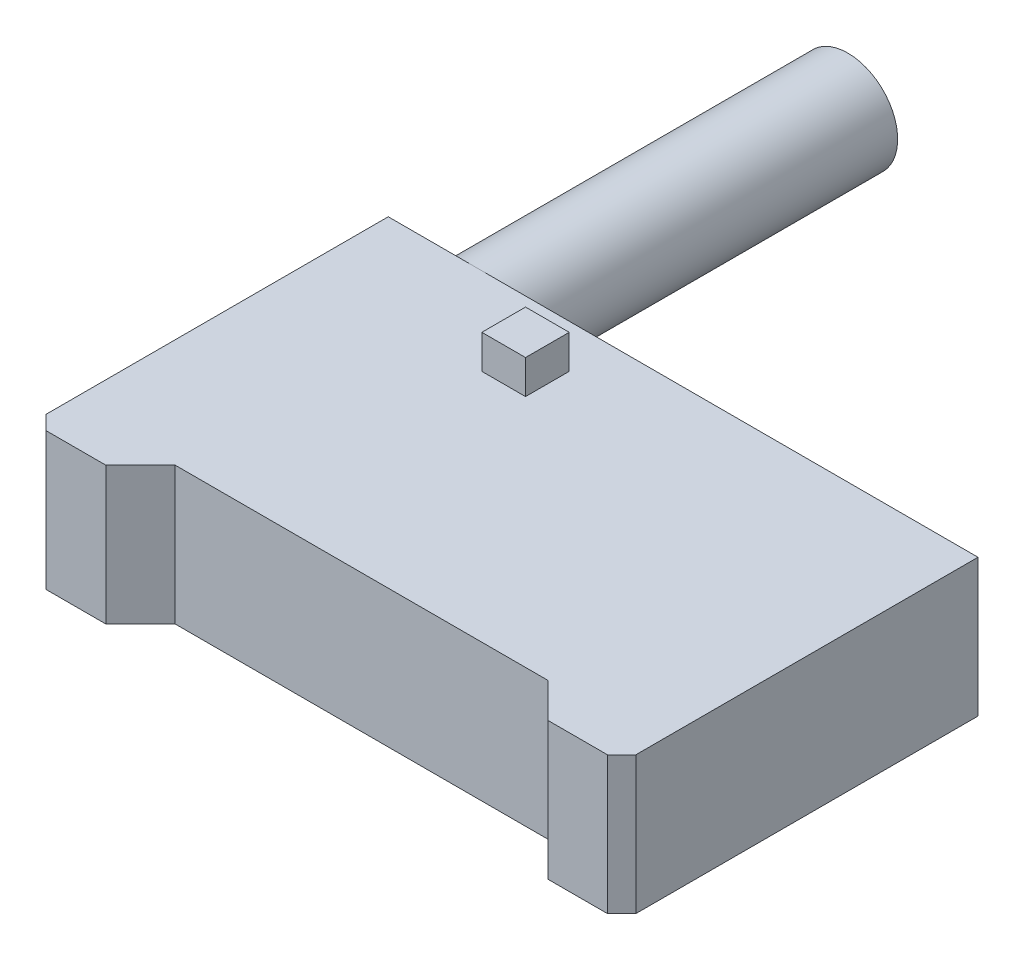
ISO-10303-21;
HEADER;
FILE_DESCRIPTION(('STEP AP214'),'2;1');
FILE_NAME('part.step','',(''),(''),'','','');
FILE_SCHEMA(('AUTOMOTIVE_DESIGN { 1 0 10303 214 1 1 1 1 }'));
ENDSEC;
DATA;
#1=APPLICATION_CONTEXT('core data for automotive mechanical design processes');
#2=APPLICATION_PROTOCOL_DEFINITION('international standard','automotive_design',2000,#1);
#3=PRODUCT_CONTEXT('',#1,'mechanical');
#4=PRODUCT('Part','Part','',(#3));
#5=PRODUCT_RELATED_PRODUCT_CATEGORY('part','',(#4));
#6=PRODUCT_DEFINITION_FORMATION('','',#4);
#7=PRODUCT_DEFINITION_CONTEXT('part definition',#1,'design');
#8=PRODUCT_DEFINITION('design','',#6,#7);
#9=PRODUCT_DEFINITION_SHAPE('','',#8);
#10=(LENGTH_UNIT() NAMED_UNIT(*) SI_UNIT(.MILLI.,.METRE.));
#11=(NAMED_UNIT(*) PLANE_ANGLE_UNIT() SI_UNIT($,.RADIAN.));
#12=(NAMED_UNIT(*) SI_UNIT($,.STERADIAN.) SOLID_ANGLE_UNIT());
#13=UNCERTAINTY_MEASURE_WITH_UNIT(LENGTH_MEASURE(1.E-05),#10,'distance_accuracy_value','');
#14=(GEOMETRIC_REPRESENTATION_CONTEXT(3) GLOBAL_UNCERTAINTY_ASSIGNED_CONTEXT((#13)) GLOBAL_UNIT_ASSIGNED_CONTEXT((#10,
#11,#12)) REPRESENTATION_CONTEXT('',''));
#15=CARTESIAN_POINT('',(0.,0.,0.));
#16=DIRECTION('',(0.,0.,1.));
#17=DIRECTION('',(1.,0.,0.));
#18=AXIS2_PLACEMENT_3D('',#15,#16,#17);
#19=CARTESIAN_POINT('',(0.,12.3952,0.));
#20=DIRECTION('',(0.,1.,0.));
#21=DIRECTION('',(0.,0.,1.));
#22=AXIS2_PLACEMENT_3D('',#19,#20,#21);
#23=PLANE('',#22);
#24=DIRECTION('',(-0.707106781186548,0.,-0.707106781186548));
#25=VECTOR('',#24,1.);
#26=CARTESIAN_POINT('',(-21.45665,12.3952,21.45665));
#27=LINE('',#26,#25);
#28=CARTESIAN_POINT('',(-25.2984,12.3952,17.6149));
#29=VERTEX_POINT('',#28);
#30=CARTESIAN_POINT('',(-26.5684,12.3952,16.3449));
#31=VERTEX_POINT('',#30);
#32=EDGE_CURVE('E209',#29,#31,#27,.T.);
#33=ORIENTED_EDGE('',*,*,#32,.F.);
#34=DIRECTION('',(1.,0.,0.));
#35=VECTOR('',#34,1.);
#36=CARTESIAN_POINT('',(0.,12.3952,17.6149));
#37=LINE('',#36,#35);
#38=CARTESIAN_POINT('',(-19.9136,12.3952,17.6149));
#39=VERTEX_POINT('',#38);
#40=EDGE_CURVE('E260',#29,#39,#37,.T.);
#41=ORIENTED_EDGE('',*,*,#40,.T.);
#42=DIRECTION('',(0.707106781186546,0.,-0.707106781186549));
#43=VECTOR('',#42,1.);
#44=CARTESIAN_POINT('',(-1.14935000000005,12.3952,-1.14935000000004));
#45=LINE('',#44,#43);
#46=CARTESIAN_POINT('',(-16.7894,12.3952,14.4907));
#47=VERTEX_POINT('',#46);
#48=EDGE_CURVE('E237',#39,#47,#45,.T.);
#49=ORIENTED_EDGE('',*,*,#48,.T.);
#50=DIRECTION('',(-1.,0.,0.));
#51=VECTOR('',#50,1.);
#52=CARTESIAN_POINT('',(0.,12.3952,14.4907));
#53=LINE('',#52,#51);
#54=CARTESIAN_POINT('',(16.7894000000001,12.3952,14.4907));
#55=VERTEX_POINT('',#54);
#56=EDGE_CURVE('E246',#55,#47,#53,.T.);
#57=ORIENTED_EDGE('',*,*,#56,.F.);
#58=DIRECTION('',(-0.707106781186544,0.,-0.707106781186551));
#59=VECTOR('',#58,1.);
#60=CARTESIAN_POINT('',(1.14935000000012,12.3952,-1.14935000000011));
#61=LINE('',#60,#59);
#62=CARTESIAN_POINT('',(19.9136,12.3952,17.6149));
#63=VERTEX_POINT('',#62);
#64=EDGE_CURVE('E253',#63,#55,#61,.T.);
#65=ORIENTED_EDGE('',*,*,#64,.F.);
#66=DIRECTION('',(-1.,0.,0.));
#67=VECTOR('',#66,1.);
#68=CARTESIAN_POINT('',(0.,12.3952,17.6149));
#69=LINE('',#68,#67);
#70=CARTESIAN_POINT('',(25.2984,12.3952,17.6149));
#71=VERTEX_POINT('',#70);
#72=EDGE_CURVE('E254',#71,#63,#69,.T.);
#73=ORIENTED_EDGE('',*,*,#72,.F.);
#74=DIRECTION('',(0.707106781186551,0.,-0.707106781186544));
#75=VECTOR('',#74,1.);
#76=CARTESIAN_POINT('',(21.4566499999999,12.3952,21.4566500000001));
#77=LINE('',#76,#75);
#78=CARTESIAN_POINT('',(26.5684,12.3952,16.3449));
#79=VERTEX_POINT('',#78);
#80=EDGE_CURVE('E145',#71,#79,#77,.T.);
#81=ORIENTED_EDGE('',*,*,#80,.T.);
#82=DIRECTION('',(0.,0.,-1.));
#83=VECTOR('',#82,1.);
#84=CARTESIAN_POINT('',(26.5684,12.3952,0.));
#85=LINE('',#84,#83);
#86=CARTESIAN_POINT('',(26.5684,12.3952,-14.4907));
#87=VERTEX_POINT('',#86);
#88=EDGE_CURVE('E133',#79,#87,#85,.T.);
#89=ORIENTED_EDGE('',*,*,#88,.T.);
#90=DIRECTION('',(-1.,0.,0.));
#91=VECTOR('',#90,1.);
#92=CARTESIAN_POINT('',(0.,12.3952,-14.4907));
#93=LINE('',#92,#91);
#94=CARTESIAN_POINT('',(-18.6309,12.3952,-14.4907));
#95=VERTEX_POINT('',#94);
#96=EDGE_CURVE('E137',#87,#95,#93,.T.);
#97=ORIENTED_EDGE('',*,*,#96,.T.);
#98=CARTESIAN_POINT('',(-26.5684,12.3952,-14.4907));
#99=VERTEX_POINT('',#98);
#100=EDGE_CURVE('E149',#95,#99,#93,.T.);
#101=ORIENTED_EDGE('',*,*,#100,.T.);
#102=DIRECTION('',(0.,0.,-1.));
#103=VECTOR('',#102,1.);
#104=CARTESIAN_POINT('',(-26.5684,12.3952,0.));
#105=LINE('',#104,#103);
#106=EDGE_CURVE('E169',#31,#99,#105,.T.);
#107=ORIENTED_EDGE('',*,*,#106,.F.);
#108=EDGE_LOOP('',(#33,#41,#49,#57,#65,#73,#81,#89,#97,#101,#107));
#109=FACE_BOUND('',#108,.T.);
#110=DIRECTION('',(1.,0.,0.));
#111=VECTOR('',#110,1.);
#112=CARTESIAN_POINT('',(-10.287,12.3952,-6.64210000000001));
#113=LINE('',#112,#111);
#114=CARTESIAN_POINT('',(-10.287,12.3952,-6.64210000000001));
#115=VERTEX_POINT('',#114);
#116=CARTESIAN_POINT('',(-6.34999999999998,12.3952,-6.64210000000001));
#117=VERTEX_POINT('',#116);
#118=EDGE_CURVE('E564',#115,#117,#113,.T.);
#119=ORIENTED_EDGE('',*,*,#118,.F.);
#120=DIRECTION('',(0.,0.,1.));
#121=VECTOR('',#120,1.);
#122=CARTESIAN_POINT('',(-10.287,12.3952,-10.5791));
#123=LINE('',#122,#121);
#124=CARTESIAN_POINT('',(-10.287,12.3952,-10.5791));
#125=VERTEX_POINT('',#124);
#126=EDGE_CURVE('E416',#125,#115,#123,.T.);
#127=ORIENTED_EDGE('',*,*,#126,.F.);
#128=DIRECTION('',(-1.,0.,0.));
#129=VECTOR('',#128,1.);
#130=CARTESIAN_POINT('',(-10.287,12.3952,-10.5791));
#131=LINE('',#130,#129);
#132=CARTESIAN_POINT('',(-6.34999999999998,12.3952,-10.5791));
#133=VERTEX_POINT('',#132);
#134=EDGE_CURVE('E414',#133,#125,#131,.T.);
#135=ORIENTED_EDGE('',*,*,#134,.F.);
#136=DIRECTION('',(0.,0.,-1.));
#137=VECTOR('',#136,1.);
#138=CARTESIAN_POINT('',(-6.34999999999998,12.3952,-10.5791));
#139=LINE('',#138,#137);
#140=EDGE_CURVE('E560',#117,#133,#139,.T.);
#141=ORIENTED_EDGE('',*,*,#140,.F.);
#142=EDGE_LOOP('',(#119,#127,#135,#141));
#143=FACE_BOUND('',#142,.T.);
#144=ADVANCED_FACE('F44',(#109,#143),#23,.T.);
#145=CARTESIAN_POINT('',(-21.45665,12.3952,21.45665));
#146=DIRECTION('',(-0.707106781186547,0.,0.707106781186547));
#147=DIRECTION('',(0.707106781186548,0.,0.707106781186548));
#148=AXIS2_PLACEMENT_3D('',#145,#146,#147);
#149=PLANE('',#148);
#150=DIRECTION('',(-0.707106781186548,0.,-0.707106781186548));
#151=VECTOR('',#150,1.);
#152=CARTESIAN_POINT('',(-21.45665,0.,21.45665));
#153=LINE('',#152,#151);
#154=CARTESIAN_POINT('',(-25.2984,0.,17.6149));
#155=VERTEX_POINT('',#154);
#156=CARTESIAN_POINT('',(-26.5684,0.,16.3449));
#157=VERTEX_POINT('',#156);
#158=EDGE_CURVE('E173',#155,#157,#153,.T.);
#159=ORIENTED_EDGE('',*,*,#158,.F.);
#160=DIRECTION('',(0.,-1.,0.));
#161=VECTOR('',#160,1.);
#162=CARTESIAN_POINT('',(-25.2984,12.3952,17.6149));
#163=LINE('',#162,#161);
#164=EDGE_CURVE('E11',#29,#155,#163,.T.);
#165=ORIENTED_EDGE('',*,*,#164,.F.);
#166=ORIENTED_EDGE('',*,*,#32,.T.);
#167=DIRECTION('',(0.,-1.,0.));
#168=VECTOR('',#167,1.);
#169=CARTESIAN_POINT('',(-26.5684,12.3952,16.3449));
#170=LINE('',#169,#168);
#171=EDGE_CURVE('E67',#31,#157,#170,.T.);
#172=ORIENTED_EDGE('',*,*,#171,.T.);
#173=EDGE_LOOP('',(#159,#165,#166,#172));
#174=FACE_BOUND('',#173,.T.);
#175=ADVANCED_FACE('F50',(#174),#149,.T.);
#176=CARTESIAN_POINT('',(0.,12.3952,17.6149));
#177=DIRECTION('',(0.,0.,-1.));
#178=DIRECTION('',(-1.,0.,0.));
#179=AXIS2_PLACEMENT_3D('',#176,#177,#178);
#180=PLANE('',#179);
#181=DIRECTION('',(1.,0.,0.));
#182=VECTOR('',#181,1.);
#183=CARTESIAN_POINT('',(0.,0.,17.6149));
#184=LINE('',#183,#182);
#185=CARTESIAN_POINT('',(-19.9136,0.,17.6149));
#186=VERTEX_POINT('',#185);
#187=EDGE_CURVE('E180',#155,#186,#184,.T.);
#188=ORIENTED_EDGE('',*,*,#187,.T.);
#189=DIRECTION('',(0.,-1.,0.));
#190=VECTOR('',#189,1.);
#191=CARTESIAN_POINT('',(-19.9136,12.3952,17.6149));
#192=LINE('',#191,#190);
#193=EDGE_CURVE('E53',#39,#186,#192,.T.);
#194=ORIENTED_EDGE('',*,*,#193,.F.);
#195=ORIENTED_EDGE('',*,*,#40,.F.);
#196=ORIENTED_EDGE('',*,*,#164,.T.);
#197=EDGE_LOOP('',(#188,#194,#195,#196));
#198=FACE_BOUND('',#197,.T.);
#199=ADVANCED_FACE('F286',(#198),#180,.F.);
#200=CARTESIAN_POINT('',(-1.14935000000005,12.3952,-1.14935000000004));
#201=DIRECTION('',(-0.707106781186549,0.,-0.707106781186546));
#202=DIRECTION('',(-0.707106781186546,0.,0.707106781186549));
#203=AXIS2_PLACEMENT_3D('',#200,#201,#202);
#204=PLANE('',#203);
#205=DIRECTION('',(0.707106781186546,0.,-0.707106781186549));
#206=VECTOR('',#205,1.);
#207=CARTESIAN_POINT('',(-1.14935000000005,0.,-1.14935000000004));
#208=LINE('',#207,#206);
#209=CARTESIAN_POINT('',(-16.7894,0.,14.4907));
#210=VERTEX_POINT('',#209);
#211=EDGE_CURVE('E185',#186,#210,#208,.T.);
#212=ORIENTED_EDGE('',*,*,#211,.T.);
#213=DIRECTION('',(0.,-1.,0.));
#214=VECTOR('',#213,1.);
#215=CARTESIAN_POINT('',(-16.7894,12.3952,14.4907));
#216=LINE('',#215,#214);
#217=EDGE_CURVE('E227',#47,#210,#216,.T.);
#218=ORIENTED_EDGE('',*,*,#217,.F.);
#219=ORIENTED_EDGE('',*,*,#48,.F.);
#220=ORIENTED_EDGE('',*,*,#193,.T.);
#221=EDGE_LOOP('',(#212,#218,#219,#220));
#222=FACE_BOUND('',#221,.T.);
#223=ADVANCED_FACE('F233',(#222),#204,.F.);
#224=CARTESIAN_POINT('',(0.,12.3952,14.4907));
#225=DIRECTION('',(0.,0.,1.));
#226=DIRECTION('',(1.,0.,0.));
#227=AXIS2_PLACEMENT_3D('',#224,#225,#226);
#228=PLANE('',#227);
#229=DIRECTION('',(-1.,0.,0.));
#230=VECTOR('',#229,1.);
#231=CARTESIAN_POINT('',(0.,0.,14.4907));
#232=LINE('',#231,#230);
#233=CARTESIAN_POINT('',(16.7894000000001,0.,14.4907));
#234=VERTEX_POINT('',#233);
#235=EDGE_CURVE('E187',#234,#210,#232,.T.);
#236=ORIENTED_EDGE('',*,*,#235,.F.);
#237=DIRECTION('',(0.,-1.,0.));
#238=VECTOR('',#237,1.);
#239=CARTESIAN_POINT('',(16.7894000000001,12.3952,14.4907));
#240=LINE('',#239,#238);
#241=EDGE_CURVE('E224',#55,#234,#240,.T.);
#242=ORIENTED_EDGE('',*,*,#241,.F.);
#243=ORIENTED_EDGE('',*,*,#56,.T.);
#244=ORIENTED_EDGE('',*,*,#217,.T.);
#245=EDGE_LOOP('',(#236,#242,#243,#244));
#246=FACE_BOUND('',#245,.T.);
#247=ADVANCED_FACE('F241',(#246),#228,.T.);
#248=CARTESIAN_POINT('',(1.14935000000012,12.3952,-1.14935000000011));
#249=DIRECTION('',(-0.707106781186551,0.,0.707106781186544));
#250=DIRECTION('',(0.707106781186544,0.,0.707106781186551));
#251=AXIS2_PLACEMENT_3D('',#248,#249,#250);
#252=PLANE('',#251);
#253=DIRECTION('',(-0.707106781186544,0.,-0.707106781186551));
#254=VECTOR('',#253,1.);
#255=CARTESIAN_POINT('',(1.14935000000012,0.,-1.14935000000011));
#256=LINE('',#255,#254);
#257=CARTESIAN_POINT('',(19.9136,0.,17.6149));
#258=VERTEX_POINT('',#257);
#259=EDGE_CURVE('E188',#258,#234,#256,.T.);
#260=ORIENTED_EDGE('',*,*,#259,.F.);
#261=DIRECTION('',(0.,-1.,0.));
#262=VECTOR('',#261,1.);
#263=CARTESIAN_POINT('',(19.9136,12.3952,17.6149));
#264=LINE('',#263,#262);
#265=EDGE_CURVE('E219',#63,#258,#264,.T.);
#266=ORIENTED_EDGE('',*,*,#265,.F.);
#267=ORIENTED_EDGE('',*,*,#64,.T.);
#268=ORIENTED_EDGE('',*,*,#241,.T.);
#269=EDGE_LOOP('',(#260,#266,#267,#268));
#270=FACE_BOUND('',#269,.T.);
#271=ADVANCED_FACE('F268',(#270),#252,.T.);
#272=CARTESIAN_POINT('',(0.,12.3952,17.6149));
#273=DIRECTION('',(0.,0.,1.));
#274=DIRECTION('',(1.,0.,0.));
#275=AXIS2_PLACEMENT_3D('',#272,#273,#274);
#276=PLANE('',#275);
#277=DIRECTION('',(-1.,0.,0.));
#278=VECTOR('',#277,1.);
#279=CARTESIAN_POINT('',(0.,0.,17.6149));
#280=LINE('',#279,#278);
#281=CARTESIAN_POINT('',(25.2984,0.,17.6149));
#282=VERTEX_POINT('',#281);
#283=EDGE_CURVE('E193',#282,#258,#280,.T.);
#284=ORIENTED_EDGE('',*,*,#283,.F.);
#285=DIRECTION('',(0.,-1.,0.));
#286=VECTOR('',#285,1.);
#287=CARTESIAN_POINT('',(25.2984,12.3952,17.6149));
#288=LINE('',#287,#286);
#289=EDGE_CURVE('E220',#71,#282,#288,.T.);
#290=ORIENTED_EDGE('',*,*,#289,.F.);
#291=ORIENTED_EDGE('',*,*,#72,.T.);
#292=ORIENTED_EDGE('',*,*,#265,.T.);
#293=EDGE_LOOP('',(#284,#290,#291,#292));
#294=FACE_BOUND('',#293,.T.);
#295=ADVANCED_FACE('F266',(#294),#276,.T.);
#296=CARTESIAN_POINT('',(21.4566499999999,12.3952,21.4566500000001));
#297=DIRECTION('',(-0.707106781186544,0.,-0.707106781186551));
#298=DIRECTION('',(-0.707106781186551,0.,0.707106781186544));
#299=AXIS2_PLACEMENT_3D('',#296,#297,#298);
#300=PLANE('',#299);
#301=DIRECTION('',(0.707106781186551,0.,-0.707106781186544));
#302=VECTOR('',#301,1.);
#303=CARTESIAN_POINT('',(21.4566499999999,0.,21.4566500000001));
#304=LINE('',#303,#302);
#305=CARTESIAN_POINT('',(26.5684,0.,16.3449));
#306=VERTEX_POINT('',#305);
#307=EDGE_CURVE('E196',#282,#306,#304,.T.);
#308=ORIENTED_EDGE('',*,*,#307,.T.);
#309=DIRECTION('',(0.,-1.,0.));
#310=VECTOR('',#309,1.);
#311=CARTESIAN_POINT('',(26.5684,12.3952,16.3449));
#312=LINE('',#311,#310);
#313=EDGE_CURVE('E159',#79,#306,#312,.T.);
#314=ORIENTED_EDGE('',*,*,#313,.F.);
#315=ORIENTED_EDGE('',*,*,#80,.F.);
#316=ORIENTED_EDGE('',*,*,#289,.T.);
#317=EDGE_LOOP('',(#308,#314,#315,#316));
#318=FACE_BOUND('',#317,.T.);
#319=ADVANCED_FACE('F271',(#318),#300,.F.);
#320=CARTESIAN_POINT('',(26.5684,12.3952,0.));
#321=DIRECTION('',(-1.,0.,0.));
#322=DIRECTION('',(0.,0.,1.));
#323=AXIS2_PLACEMENT_3D('',#320,#321,#322);
#324=PLANE('',#323);
#325=DIRECTION('',(0.,0.,-1.));
#326=VECTOR('',#325,1.);
#327=CARTESIAN_POINT('',(26.5684,0.,0.));
#328=LINE('',#327,#326);
#329=CARTESIAN_POINT('',(26.5684,0.,-14.4907));
#330=VERTEX_POINT('',#329);
#331=EDGE_CURVE('E154',#306,#330,#328,.T.);
#332=ORIENTED_EDGE('',*,*,#331,.T.);
#333=DIRECTION('',(0.,-1.,0.));
#334=VECTOR('',#333,1.);
#335=CARTESIAN_POINT('',(26.5684,12.3952,-14.4907));
#336=LINE('',#335,#334);
#337=EDGE_CURVE('E155',#87,#330,#336,.T.);
#338=ORIENTED_EDGE('',*,*,#337,.F.);
#339=ORIENTED_EDGE('',*,*,#88,.F.);
#340=ORIENTED_EDGE('',*,*,#313,.T.);
#341=EDGE_LOOP('',(#332,#338,#339,#340));
#342=FACE_BOUND('',#341,.T.);
#343=ADVANCED_FACE('F153',(#342),#324,.F.);
#344=CARTESIAN_POINT('',(0.,12.3952,-14.4907));
#345=DIRECTION('',(0.,0.,1.));
#346=DIRECTION('',(1.,0.,0.));
#347=AXIS2_PLACEMENT_3D('',#344,#345,#346);
#348=PLANE('',#347);
#349=ORIENTED_EDGE('',*,*,#100,.F.);
#350=CARTESIAN_POINT('',(-18.6309,7.9121,-14.4907));
#351=DIRECTION('',(0.,0.,-1.));
#352=DIRECTION('',(-1.,0.,0.));
#353=AXIS2_PLACEMENT_3D('',#350,#351,#352);
#354=CIRCLE('',#353,4.4831);
#355=EDGE_CURVE('E167',#95,#95,#354,.T.);
#356=ORIENTED_EDGE('',*,*,#355,.F.);
#357=ORIENTED_EDGE('',*,*,#96,.F.);
#358=ORIENTED_EDGE('',*,*,#337,.T.);
#359=DIRECTION('',(-1.,0.,0.));
#360=VECTOR('',#359,1.);
#361=CARTESIAN_POINT('',(0.,0.,-14.4907));
#362=LINE('',#361,#360);
#363=CARTESIAN_POINT('',(-26.5684,0.,-14.4907));
#364=VERTEX_POINT('',#363);
#365=EDGE_CURVE('E201',#330,#364,#362,.T.);
#366=ORIENTED_EDGE('',*,*,#365,.T.);
#367=DIRECTION('',(0.,-1.,0.));
#368=VECTOR('',#367,1.);
#369=CARTESIAN_POINT('',(-26.5684,12.3952,-14.4907));
#370=LINE('',#369,#368);
#371=EDGE_CURVE('E161',#99,#364,#370,.T.);
#372=ORIENTED_EDGE('',*,*,#371,.F.);
#373=EDGE_LOOP('',(#349,#356,#357,#358,#366,#372));
#374=FACE_BOUND('',#373,.T.);
#375=ADVANCED_FACE('F163',(#374),#348,.F.);
#376=CARTESIAN_POINT('',(-26.5684,12.3952,0.));
#377=DIRECTION('',(-1.,0.,0.));
#378=DIRECTION('',(0.,0.,1.));
#379=AXIS2_PLACEMENT_3D('',#376,#377,#378);
#380=PLANE('',#379);
#381=DIRECTION('',(0.,0.,-1.));
#382=VECTOR('',#381,1.);
#383=CARTESIAN_POINT('',(-26.5684,0.,0.));
#384=LINE('',#383,#382);
#385=EDGE_CURVE('E206',#157,#364,#384,.T.);
#386=ORIENTED_EDGE('',*,*,#385,.F.);
#387=ORIENTED_EDGE('',*,*,#171,.F.);
#388=ORIENTED_EDGE('',*,*,#106,.T.);
#389=ORIENTED_EDGE('',*,*,#371,.T.);
#390=EDGE_LOOP('',(#386,#387,#388,#389));
#391=FACE_BOUND('',#390,.T.);
#392=ADVANCED_FACE('F294',(#391),#380,.T.);
#393=CARTESIAN_POINT('',(0.,0.,0.));
#394=DIRECTION('',(0.,1.,0.));
#395=DIRECTION('',(0.,0.,1.));
#396=AXIS2_PLACEMENT_3D('',#393,#394,#395);
#397=PLANE('',#396);
#398=ORIENTED_EDGE('',*,*,#158,.T.);
#399=ORIENTED_EDGE('',*,*,#385,.T.);
#400=ORIENTED_EDGE('',*,*,#365,.F.);
#401=ORIENTED_EDGE('',*,*,#331,.F.);
#402=ORIENTED_EDGE('',*,*,#307,.F.);
#403=ORIENTED_EDGE('',*,*,#283,.T.);
#404=ORIENTED_EDGE('',*,*,#259,.T.);
#405=ORIENTED_EDGE('',*,*,#235,.T.);
#406=ORIENTED_EDGE('',*,*,#211,.F.);
#407=ORIENTED_EDGE('',*,*,#187,.F.);
#408=EDGE_LOOP('',(#398,#399,#400,#401,#402,#403,#404,#405,#406,#407));
#409=FACE_BOUND('',#408,.T.);
#410=ADVANCED_FACE('F238',(#409),#397,.F.);
#411=CARTESIAN_POINT('',(-18.6309,7.9121,-47.9679));
#412=DIRECTION('',(0.,0.,1.));
#413=DIRECTION('',(1.,0.,0.));
#414=AXIS2_PLACEMENT_3D('',#411,#412,#413);
#415=CYLINDRICAL_SURFACE('',#414,4.4831);
#416=CARTESIAN_POINT('',(-18.6309,7.9121,-47.9679));
#417=DIRECTION('',(0.,0.,-1.));
#418=DIRECTION('',(-1.,0.,0.));
#419=AXIS2_PLACEMENT_3D('',#416,#417,#418);
#420=CIRCLE('',#419,4.4831);
#421=CARTESIAN_POINT('',(-23.114,7.9121,-47.9679));
#422=VERTEX_POINT('',#421);
#423=EDGE_CURVE('E178',#422,#422,#420,.T.);
#424=ORIENTED_EDGE('',*,*,#423,.F.);
#425=EDGE_LOOP('',(#424));
#426=FACE_BOUND('',#425,.T.);
#427=ORIENTED_EDGE('',*,*,#355,.T.);
#428=EDGE_LOOP('',(#427));
#429=FACE_BOUND('',#428,.T.);
#430=ADVANCED_FACE('F287',(#426,#429),#415,.T.);
#431=CARTESIAN_POINT('',(-18.6309,7.9121,-47.9679));
#432=DIRECTION('',(0.,0.,-1.));
#433=DIRECTION('',(-1.,0.,0.));
#434=AXIS2_PLACEMENT_3D('',#431,#432,#433);
#435=PLANE('',#434);
#436=ORIENTED_EDGE('',*,*,#423,.T.);
#437=EDGE_LOOP('',(#436));
#438=FACE_BOUND('',#437,.T.);
#439=ADVANCED_FACE('F309',(#438),#435,.T.);
#440=CARTESIAN_POINT('',(-10.287,15.4432,-10.5791));
#441=DIRECTION('',(1.,0.,0.));
#442=DIRECTION('',(0.,0.,-1.));
#443=AXIS2_PLACEMENT_3D('',#440,#441,#442);
#444=PLANE('',#443);
#445=ORIENTED_EDGE('',*,*,#126,.T.);
#446=DIRECTION('',(0.,-1.,0.));
#447=VECTOR('',#446,1.);
#448=CARTESIAN_POINT('',(-10.287,15.4432,-6.64210000000001));
#449=LINE('',#448,#447);
#450=CARTESIAN_POINT('',(-10.287,15.4432,-6.64210000000001));
#451=VERTEX_POINT('',#450);
#452=EDGE_CURVE('E412',#451,#115,#449,.T.);
#453=ORIENTED_EDGE('',*,*,#452,.F.);
#454=DIRECTION('',(0.,0.,1.));
#455=VECTOR('',#454,1.);
#456=CARTESIAN_POINT('',(-10.287,15.4432,-10.5791));
#457=LINE('',#456,#455);
#458=CARTESIAN_POINT('',(-10.287,15.4432,-10.5791));
#459=VERTEX_POINT('',#458);
#460=EDGE_CURVE('E396',#459,#451,#457,.T.);
#461=ORIENTED_EDGE('',*,*,#460,.F.);
#462=DIRECTION('',(0.,-1.,0.));
#463=VECTOR('',#462,1.);
#464=CARTESIAN_POINT('',(-10.287,15.4432,-10.5791));
#465=LINE('',#464,#463);
#466=EDGE_CURVE('E551',#459,#125,#465,.T.);
#467=ORIENTED_EDGE('',*,*,#466,.T.);
#468=EDGE_LOOP('',(#445,#453,#461,#467));
#469=FACE_BOUND('',#468,.T.);
#470=ADVANCED_FACE('F320',(#469),#444,.F.);
#471=CARTESIAN_POINT('',(-10.287,15.4432,-6.64210000000001));
#472=DIRECTION('',(0.,0.,-1.));
#473=DIRECTION('',(-1.,0.,0.));
#474=AXIS2_PLACEMENT_3D('',#471,#472,#473);
#475=PLANE('',#474);
#476=ORIENTED_EDGE('',*,*,#118,.T.);
#477=DIRECTION('',(0.,-1.,0.));
#478=VECTOR('',#477,1.);
#479=CARTESIAN_POINT('',(-6.34999999999998,15.4432,-6.64210000000001));
#480=LINE('',#479,#478);
#481=CARTESIAN_POINT('',(-6.34999999999998,15.4432,-6.64210000000001));
#482=VERTEX_POINT('',#481);
#483=EDGE_CURVE('E425',#482,#117,#480,.T.);
#484=ORIENTED_EDGE('',*,*,#483,.F.);
#485=DIRECTION('',(1.,0.,0.));
#486=VECTOR('',#485,1.);
#487=CARTESIAN_POINT('',(-10.287,15.4432,-6.64210000000001));
#488=LINE('',#487,#486);
#489=EDGE_CURVE('E405',#451,#482,#488,.T.);
#490=ORIENTED_EDGE('',*,*,#489,.F.);
#491=ORIENTED_EDGE('',*,*,#452,.T.);
#492=EDGE_LOOP('',(#476,#484,#490,#491));
#493=FACE_BOUND('',#492,.T.);
#494=ADVANCED_FACE('F348',(#493),#475,.F.);
#495=CARTESIAN_POINT('',(-6.34999999999998,15.4432,-10.5791));
#496=DIRECTION('',(-1.,0.,0.));
#497=DIRECTION('',(0.,0.,1.));
#498=AXIS2_PLACEMENT_3D('',#495,#496,#497);
#499=PLANE('',#498);
#500=ORIENTED_EDGE('',*,*,#140,.T.);
#501=DIRECTION('',(0.,-1.,0.));
#502=VECTOR('',#501,1.);
#503=CARTESIAN_POINT('',(-6.34999999999998,15.4432,-10.5791));
#504=LINE('',#503,#502);
#505=CARTESIAN_POINT('',(-6.34999999999998,15.4432,-10.5791));
#506=VERTEX_POINT('',#505);
#507=EDGE_CURVE('E62',#506,#133,#504,.T.);
#508=ORIENTED_EDGE('',*,*,#507,.F.);
#509=DIRECTION('',(0.,0.,-1.));
#510=VECTOR('',#509,1.);
#511=CARTESIAN_POINT('',(-6.34999999999998,15.4432,-10.5791));
#512=LINE('',#511,#510);
#513=EDGE_CURVE('E574',#482,#506,#512,.T.);
#514=ORIENTED_EDGE('',*,*,#513,.F.);
#515=ORIENTED_EDGE('',*,*,#483,.T.);
#516=EDGE_LOOP('',(#500,#508,#514,#515));
#517=FACE_BOUND('',#516,.T.);
#518=ADVANCED_FACE('F357',(#517),#499,.F.);
#519=CARTESIAN_POINT('',(-10.287,15.4432,-10.5791));
#520=DIRECTION('',(0.,0.,1.));
#521=DIRECTION('',(1.,0.,0.));
#522=AXIS2_PLACEMENT_3D('',#519,#520,#521);
#523=PLANE('',#522);
#524=ORIENTED_EDGE('',*,*,#134,.T.);
#525=ORIENTED_EDGE('',*,*,#466,.F.);
#526=DIRECTION('',(-1.,0.,0.));
#527=VECTOR('',#526,1.);
#528=CARTESIAN_POINT('',(-10.287,15.4432,-10.5791));
#529=LINE('',#528,#527);
#530=EDGE_CURVE('E403',#506,#459,#529,.T.);
#531=ORIENTED_EDGE('',*,*,#530,.F.);
#532=ORIENTED_EDGE('',*,*,#507,.T.);
#533=EDGE_LOOP('',(#524,#525,#531,#532));
#534=FACE_BOUND('',#533,.T.);
#535=ADVANCED_FACE('F367',(#534),#523,.F.);
#536=CARTESIAN_POINT('',(0.,15.4432,0.));
#537=DIRECTION('',(0.,1.,0.));
#538=DIRECTION('',(0.,0.,1.));
#539=AXIS2_PLACEMENT_3D('',#536,#537,#538);
#540=PLANE('',#539);
#541=ORIENTED_EDGE('',*,*,#460,.T.);
#542=ORIENTED_EDGE('',*,*,#489,.T.);
#543=ORIENTED_EDGE('',*,*,#513,.T.);
#544=ORIENTED_EDGE('',*,*,#530,.T.);
#545=EDGE_LOOP('',(#541,#542,#543,#544));
#546=FACE_BOUND('',#545,.T.);
#547=ADVANCED_FACE('F379',(#546),#540,.T.);
#548=CLOSED_SHELL('',(#144,#175,#199,#223,#247,#271,#295,#319,#343,#375,#392,#410,#430,#439,
#470,#494,#518,#535,#547));
#549=MANIFOLD_SOLID_BREP('B2',#548);
#550=ADVANCED_BREP_SHAPE_REPRESENTATION('',(#18,#549),#14);
#551=SHAPE_DEFINITION_REPRESENTATION(#9,#550);
ENDSEC;
END-ISO-10303-21;
